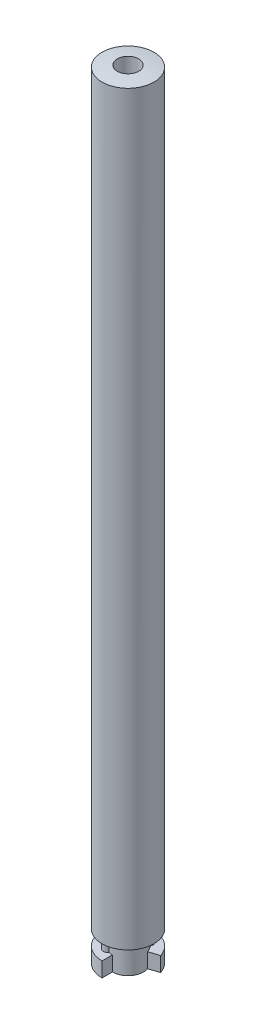
ISO-10303-21;
HEADER;
FILE_DESCRIPTION(('STEP AP214'),'2;1');
FILE_NAME('part.step','',(''),(''),'','','');
FILE_SCHEMA(('AUTOMOTIVE_DESIGN { 1 0 10303 214 1 1 1 1 }'));
ENDSEC;
DATA;
#1=APPLICATION_CONTEXT('core data for automotive mechanical design processes');
#2=APPLICATION_PROTOCOL_DEFINITION('international standard','automotive_design',2000,#1);
#3=PRODUCT_CONTEXT('',#1,'mechanical');
#4=PRODUCT('Part','Part','',(#3));
#5=PRODUCT_RELATED_PRODUCT_CATEGORY('part','',(#4));
#6=PRODUCT_DEFINITION_FORMATION('','',#4);
#7=PRODUCT_DEFINITION_CONTEXT('part definition',#1,'design');
#8=PRODUCT_DEFINITION('design','',#6,#7);
#9=PRODUCT_DEFINITION_SHAPE('','',#8);
#10=(LENGTH_UNIT() NAMED_UNIT(*) SI_UNIT(.MILLI.,.METRE.));
#11=(NAMED_UNIT(*) PLANE_ANGLE_UNIT() SI_UNIT($,.RADIAN.));
#12=(NAMED_UNIT(*) SI_UNIT($,.STERADIAN.) SOLID_ANGLE_UNIT());
#13=UNCERTAINTY_MEASURE_WITH_UNIT(LENGTH_MEASURE(1.E-05),#10,'distance_accuracy_value','');
#14=(GEOMETRIC_REPRESENTATION_CONTEXT(3) GLOBAL_UNCERTAINTY_ASSIGNED_CONTEXT((#13)) GLOBAL_UNIT_ASSIGNED_CONTEXT((#10,
#11,#12)) REPRESENTATION_CONTEXT('',''));
#15=CARTESIAN_POINT('',(0.,0.,0.));
#16=DIRECTION('',(0.,0.,1.));
#17=DIRECTION('',(1.,0.,0.));
#18=AXIS2_PLACEMENT_3D('',#15,#16,#17);
#19=CARTESIAN_POINT('',(0.,105.,0.));
#20=DIRECTION('',(0.,-1.,0.));
#21=DIRECTION('',(0.,0.,-1.));
#22=AXIS2_PLACEMENT_3D('',#19,#20,#21);
#23=CYLINDRICAL_SURFACE('',#22,3.5);
#24=CARTESIAN_POINT('',(0.,4.,0.));
#25=DIRECTION('',(0.,-1.,0.));
#26=DIRECTION('',(0.,0.,-1.));
#27=AXIS2_PLACEMENT_3D('',#24,#25,#26);
#28=CIRCLE('',#27,3.5);
#29=CARTESIAN_POINT('',(0.,4.,-3.5));
#30=VERTEX_POINT('',#29);
#31=EDGE_CURVE('E162',#30,#30,#28,.T.);
#32=ORIENTED_EDGE('',*,*,#31,.F.);
#33=EDGE_LOOP('',(#32));
#34=FACE_BOUND('',#33,.T.);
#35=CARTESIAN_POINT('',(0.,104.7,0.));
#36=DIRECTION('',(0.,1.,0.));
#37=DIRECTION('',(0.,0.,1.));
#38=AXIS2_PLACEMENT_3D('',#35,#36,#37);
#39=CIRCLE('',#38,3.5);
#40=CARTESIAN_POINT('',(0.,104.7,3.5));
#41=VERTEX_POINT('',#40);
#42=EDGE_CURVE('E275',#41,#41,#39,.T.);
#43=ORIENTED_EDGE('',*,*,#42,.F.);
#44=EDGE_LOOP('',(#43));
#45=FACE_BOUND('',#44,.T.);
#46=ADVANCED_FACE('F39',(#34,#45),#23,.T.);
#47=CARTESIAN_POINT('',(0.,2.,0.));
#48=DIRECTION('',(0.,-1.,0.));
#49=DIRECTION('',(0.,0.,-1.));
#50=AXIS2_PLACEMENT_3D('',#47,#48,#49);
#51=CYLINDRICAL_SURFACE('',#50,2.1);
#52=CARTESIAN_POINT('',(0.,2.,0.));
#53=DIRECTION('',(0.,-1.,0.));
#54=DIRECTION('',(0.,0.,-1.));
#55=AXIS2_PLACEMENT_3D('',#52,#53,#54);
#56=CIRCLE('',#55,2.1);
#57=CARTESIAN_POINT('',(-1.49139224809552,2.,1.47842793612694));
#58=VERTEX_POINT('',#57);
#59=CARTESIAN_POINT('',(-1.99721868421978,2.,0.648935688187522));
#60=VERTEX_POINT('',#59);
#61=EDGE_CURVE('E139',#58,#60,#56,.T.);
#62=ORIENTED_EDGE('',*,*,#61,.F.);
#63=DIRECTION('',(0.,-1.,0.));
#64=VECTOR('',#63,1.);
#65=CARTESIAN_POINT('',(-1.49139224809553,3.,1.47842793612694));
#66=LINE('',#65,#64);
#67=CARTESIAN_POINT('',(-1.49139224809552,4.,1.47842793612694));
#68=VERTEX_POINT('',#67);
#69=EDGE_CURVE('E55',#58,#68,#66,.F.);
#70=ORIENTED_EDGE('',*,*,#69,.T.);
#71=CARTESIAN_POINT('',(0.,4.,0.));
#72=DIRECTION('',(0.,-1.,0.));
#73=DIRECTION('',(0.,0.,-1.));
#74=AXIS2_PLACEMENT_3D('',#71,#72,#73);
#75=CIRCLE('',#74,2.1);
#76=CARTESIAN_POINT('',(0.543519994715294,4.,-2.02844423520704));
#77=VERTEX_POINT('',#76);
#78=EDGE_CURVE('E159',#68,#77,#75,.T.);
#79=ORIENTED_EDGE('',*,*,#78,.T.);
#80=DIRECTION('',(0.,-1.,0.));
#81=VECTOR('',#80,1.);
#82=CARTESIAN_POINT('',(0.543519994715294,3.,-2.02844423520704));
#83=LINE('',#82,#81);
#84=CARTESIAN_POINT('',(0.543519994715294,2.,-2.02844423520704));
#85=VERTEX_POINT('',#84);
#86=EDGE_CURVE('E217',#77,#85,#83,.T.);
#87=ORIENTED_EDGE('',*,*,#86,.T.);
#88=CARTESIAN_POINT('',(-1.29886816183054E-13,2.,-2.1));
#89=VERTEX_POINT('',#88);
#90=EDGE_CURVE('E141',#89,#85,#56,.T.);
#91=ORIENTED_EDGE('',*,*,#90,.F.);
#92=DIRECTION('',(0.,-1.,0.));
#93=VECTOR('',#92,1.);
#94=CARTESIAN_POINT('',(-1.29886816183054E-13,2.,-2.1));
#95=LINE('',#94,#93);
#96=CARTESIAN_POINT('',(-1.29886816183054E-13,0.,-2.1));
#97=VERTEX_POINT('',#96);
#98=EDGE_CURVE('E182',#89,#97,#95,.T.);
#99=ORIENTED_EDGE('',*,*,#98,.T.);
#100=CARTESIAN_POINT('',(0.,0.,0.));
#101=DIRECTION('',(0.,-1.,0.));
#102=DIRECTION('',(0.,0.,-1.));
#103=AXIS2_PLACEMENT_3D('',#100,#101,#102);
#104=CIRCLE('',#103,2.1);
#105=CARTESIAN_POINT('',(-1.99721868421978,0.,0.648935688187522));
#106=VERTEX_POINT('',#105);
#107=EDGE_CURVE('E165',#106,#97,#104,.T.);
#108=ORIENTED_EDGE('',*,*,#107,.F.);
#109=DIRECTION('',(0.,-1.,0.));
#110=VECTOR('',#109,1.);
#111=CARTESIAN_POINT('',(-1.99721868421978,2.,0.648935688187522));
#112=LINE('',#111,#110);
#113=EDGE_CURVE('E175',#60,#106,#112,.T.);
#114=ORIENTED_EDGE('',*,*,#113,.F.);
#115=EDGE_LOOP('',(#62,#70,#79,#87,#91,#99,#108,#114));
#116=FACE_BOUND('',#115,.T.);
#117=ADVANCED_FACE('F228',(#116),#51,.T.);
#118=CARTESIAN_POINT('',(1.49139224809554,4.,-1.47842793612693));
#119=VERTEX_POINT('',#118);
#120=CARTESIAN_POINT('',(-0.543519994715282,4.,2.02844423520705));
#121=VERTEX_POINT('',#120);
#122=EDGE_CURVE('E146',#119,#121,#75,.T.);
#123=ORIENTED_EDGE('',*,*,#122,.T.);
#124=DIRECTION('',(0.,-1.,0.));
#125=VECTOR('',#124,1.);
#126=CARTESIAN_POINT('',(-0.543519994715281,3.,2.02844423520705));
#127=LINE('',#126,#125);
#128=CARTESIAN_POINT('',(-0.543519994715281,2.,2.02844423520705));
#129=VERTEX_POINT('',#128);
#130=EDGE_CURVE('E143',#121,#129,#127,.T.);
#131=ORIENTED_EDGE('',*,*,#130,.T.);
#132=CARTESIAN_POINT('',(0.,2.,2.1));
#133=VERTEX_POINT('',#132);
#134=EDGE_CURVE('E130',#133,#129,#56,.T.);
#135=ORIENTED_EDGE('',*,*,#134,.F.);
#136=DIRECTION('',(0.,-1.,0.));
#137=VECTOR('',#136,1.);
#138=CARTESIAN_POINT('',(0.,2.,2.1));
#139=LINE('',#138,#137);
#140=CARTESIAN_POINT('',(0.,0.,2.1));
#141=VERTEX_POINT('',#140);
#142=EDGE_CURVE('E204',#133,#141,#139,.T.);
#143=ORIENTED_EDGE('',*,*,#142,.T.);
#144=CARTESIAN_POINT('',(0.,0.,0.));
#145=DIRECTION('',(0.,-1.,0.));
#146=DIRECTION('',(0.,0.,-1.));
#147=AXIS2_PLACEMENT_3D('',#144,#145,#146);
#148=CIRCLE('',#147,2.1);
#149=CARTESIAN_POINT('',(1.99721868421982,0.,-0.648935688187398));
#150=VERTEX_POINT('',#149);
#151=EDGE_CURVE('E185',#150,#141,#148,.T.);
#152=ORIENTED_EDGE('',*,*,#151,.F.);
#153=DIRECTION('',(0.,-1.,0.));
#154=VECTOR('',#153,1.);
#155=CARTESIAN_POINT('',(1.99721868421982,2.,-0.648935688187398));
#156=LINE('',#155,#154);
#157=CARTESIAN_POINT('',(1.99721868421982,2.,-0.648935688187398));
#158=VERTEX_POINT('',#157);
#159=EDGE_CURVE('E197',#158,#150,#156,.T.);
#160=ORIENTED_EDGE('',*,*,#159,.F.);
#161=CARTESIAN_POINT('',(1.49139224809554,2.,-1.47842793612693));
#162=VERTEX_POINT('',#161);
#163=EDGE_CURVE('E138',#162,#158,#56,.T.);
#164=ORIENTED_EDGE('',*,*,#163,.F.);
#165=DIRECTION('',(0.,-1.,0.));
#166=VECTOR('',#165,1.);
#167=CARTESIAN_POINT('',(1.49139224809554,3.,-1.47842793612693));
#168=LINE('',#167,#166);
#169=EDGE_CURVE('E48',#162,#119,#168,.F.);
#170=ORIENTED_EDGE('',*,*,#169,.T.);
#171=EDGE_LOOP('',(#123,#131,#135,#143,#152,#160,#164,#170));
#172=FACE_BOUND('',#171,.T.);
#173=ADVANCED_FACE('F144',(#172),#51,.T.);
#174=CARTESIAN_POINT('',(0.,2.,0.));
#175=DIRECTION('',(0.,-1.,0.));
#176=DIRECTION('',(0.,0.,-1.));
#177=AXIS2_PLACEMENT_3D('',#174,#175,#176);
#178=PLANE('',#177);
#179=CARTESIAN_POINT('',(1.02599233253928,2.,-1.76814699095529));
#180=DIRECTION('',(0.,1.,0.));
#181=DIRECTION('',(0.,0.,1.));
#182=AXIS2_PLACEMENT_3D('',#179,#180,#181);
#183=CIRCLE('',#182,0.548210007324203);
#184=EDGE_CURVE('E150',#162,#85,#183,.T.);
#185=ORIENTED_EDGE('',*,*,#184,.F.);
#186=ORIENTED_EDGE('',*,*,#163,.T.);
#187=DIRECTION('',(0.951056516295152,0.,-0.309016994374951));
#188=VECTOR('',#187,1.);
#189=CARTESIAN_POINT('',(0.,2.,0.));
#190=LINE('',#189,#188);
#191=CARTESIAN_POINT('',(3.32869780703303,2.,-1.08155948031233));
#192=VERTEX_POINT('',#191);
#193=EDGE_CURVE('E193',#158,#192,#190,.T.);
#194=ORIENTED_EDGE('',*,*,#193,.T.);
#195=CARTESIAN_POINT('',(0.,2.,0.));
#196=DIRECTION('',(0.,-1.,0.));
#197=DIRECTION('',(0.,0.,-1.));
#198=AXIS2_PLACEMENT_3D('',#195,#196,#197);
#199=CIRCLE('',#198,3.5);
#200=CARTESIAN_POINT('',(0.,2.,-3.5));
#201=VERTEX_POINT('',#200);
#202=EDGE_CURVE('E166',#201,#192,#199,.T.);
#203=ORIENTED_EDGE('',*,*,#202,.F.);
#204=DIRECTION('',(0.,0.,-1.));
#205=VECTOR('',#204,1.);
#206=CARTESIAN_POINT('',(0.,2.,0.));
#207=LINE('',#206,#205);
#208=EDGE_CURVE('E171',#89,#201,#207,.T.);
#209=ORIENTED_EDGE('',*,*,#208,.F.);
#210=ORIENTED_EDGE('',*,*,#90,.T.);
#211=EDGE_LOOP('',(#185,#186,#194,#203,#209,#210));
#212=FACE_BOUND('',#211,.T.);
#213=ADVANCED_FACE('F231',(#212),#178,.F.);
#214=CARTESIAN_POINT('',(0.,4.,0.));
#215=DIRECTION('',(0.,-1.,0.));
#216=DIRECTION('',(0.,0.,-1.));
#217=AXIS2_PLACEMENT_3D('',#214,#215,#216);
#218=PLANE('',#217);
#219=ORIENTED_EDGE('',*,*,#78,.F.);
#220=CARTESIAN_POINT('',(-1.02599233253927,4.,1.76814699095529));
#221=DIRECTION('',(0.,1.,0.));
#222=DIRECTION('',(0.,0.,1.));
#223=AXIS2_PLACEMENT_3D('',#220,#221,#222);
#224=CIRCLE('',#223,0.548210007324203);
#225=EDGE_CURVE('E62',#68,#121,#224,.T.);
#226=ORIENTED_EDGE('',*,*,#225,.T.);
#227=ORIENTED_EDGE('',*,*,#122,.F.);
#228=CARTESIAN_POINT('',(1.02599233253928,4.,-1.76814699095529));
#229=DIRECTION('',(0.,1.,0.));
#230=DIRECTION('',(0.,0.,1.));
#231=AXIS2_PLACEMENT_3D('',#228,#229,#230);
#232=CIRCLE('',#231,0.548210007324203);
#233=EDGE_CURVE('E152',#119,#77,#232,.T.);
#234=ORIENTED_EDGE('',*,*,#233,.T.);
#235=EDGE_LOOP('',(#219,#226,#227,#234));
#236=FACE_BOUND('',#235,.T.);
#237=ORIENTED_EDGE('',*,*,#31,.T.);
#238=EDGE_LOOP('',(#237));
#239=FACE_BOUND('',#238,.T.);
#240=ADVANCED_FACE('F224',(#236,#239),#218,.T.);
#241=CARTESIAN_POINT('',(-1.02599233253927,2.,1.76814699095529));
#242=DIRECTION('',(0.,-1.,0.));
#243=DIRECTION('',(0.,0.,-1.));
#244=AXIS2_PLACEMENT_3D('',#241,#242,#243);
#245=CIRCLE('',#244,0.548210007324203);
#246=EDGE_CURVE('E11',#58,#129,#245,.F.);
#247=ORIENTED_EDGE('',*,*,#246,.F.);
#248=ORIENTED_EDGE('',*,*,#61,.T.);
#249=DIRECTION('',(-0.951056516295133,0.,0.30901699437501));
#250=VECTOR('',#249,1.);
#251=CARTESIAN_POINT('',(0.,2.,0.));
#252=LINE('',#251,#250);
#253=CARTESIAN_POINT('',(-3.32869780703297,2.,1.08155948031254));
#254=VERTEX_POINT('',#253);
#255=EDGE_CURVE('E169',#60,#254,#252,.T.);
#256=ORIENTED_EDGE('',*,*,#255,.T.);
#257=CARTESIAN_POINT('',(0.,2.,3.5));
#258=VERTEX_POINT('',#257);
#259=EDGE_CURVE('E158',#258,#254,#199,.T.);
#260=ORIENTED_EDGE('',*,*,#259,.F.);
#261=DIRECTION('',(0.,0.,1.));
#262=VECTOR('',#261,1.);
#263=CARTESIAN_POINT('',(0.,2.,0.));
#264=LINE('',#263,#262);
#265=EDGE_CURVE('E134',#133,#258,#264,.T.);
#266=ORIENTED_EDGE('',*,*,#265,.F.);
#267=ORIENTED_EDGE('',*,*,#134,.T.);
#268=EDGE_LOOP('',(#247,#248,#256,#260,#266,#267));
#269=FACE_BOUND('',#268,.T.);
#270=ADVANCED_FACE('F132',(#269),#178,.F.);
#271=CARTESIAN_POINT('',(0.,0.,0.));
#272=DIRECTION('',(0.,1.,0.));
#273=DIRECTION('',(0.,0.,1.));
#274=AXIS2_PLACEMENT_3D('',#271,#272,#273);
#275=PLANE('',#274);
#276=DIRECTION('',(0.,0.,-1.));
#277=VECTOR('',#276,1.);
#278=CARTESIAN_POINT('',(0.,0.,0.));
#279=LINE('',#278,#277);
#280=CARTESIAN_POINT('',(-2.16478026971757E-13,0.,-3.5));
#281=VERTEX_POINT('',#280);
#282=EDGE_CURVE('E172',#97,#281,#279,.T.);
#283=ORIENTED_EDGE('',*,*,#282,.T.);
#284=CARTESIAN_POINT('',(0.,0.,0.));
#285=DIRECTION('',(0.,1.,0.));
#286=DIRECTION('',(0.,0.,1.));
#287=AXIS2_PLACEMENT_3D('',#284,#285,#286);
#288=CIRCLE('',#287,3.5);
#289=CARTESIAN_POINT('',(3.32869780703303,0.,-1.08155948031233));
#290=VERTEX_POINT('',#289);
#291=EDGE_CURVE('E216',#290,#281,#288,.T.);
#292=ORIENTED_EDGE('',*,*,#291,.F.);
#293=DIRECTION('',(0.951056516295152,0.,-0.309016994374951));
#294=VECTOR('',#293,1.);
#295=CARTESIAN_POINT('',(0.,0.,0.));
#296=LINE('',#295,#294);
#297=EDGE_CURVE('E200',#150,#290,#296,.T.);
#298=ORIENTED_EDGE('',*,*,#297,.F.);
#299=ORIENTED_EDGE('',*,*,#151,.T.);
#300=DIRECTION('',(0.,0.,1.));
#301=VECTOR('',#300,1.);
#302=CARTESIAN_POINT('',(0.,0.,0.));
#303=LINE('',#302,#301);
#304=CARTESIAN_POINT('',(0.,0.,3.5));
#305=VERTEX_POINT('',#304);
#306=EDGE_CURVE('E195',#141,#305,#303,.T.);
#307=ORIENTED_EDGE('',*,*,#306,.T.);
#308=CARTESIAN_POINT('',(-3.32869780703297,0.,1.08155948031254));
#309=VERTEX_POINT('',#308);
#310=EDGE_CURVE('E206',#309,#305,#288,.T.);
#311=ORIENTED_EDGE('',*,*,#310,.F.);
#312=DIRECTION('',(-0.951056516295133,0.,0.30901699437501));
#313=VECTOR('',#312,1.);
#314=CARTESIAN_POINT('',(0.,0.,0.));
#315=LINE('',#314,#313);
#316=EDGE_CURVE('E178',#106,#309,#315,.T.);
#317=ORIENTED_EDGE('',*,*,#316,.F.);
#318=ORIENTED_EDGE('',*,*,#107,.T.);
#319=EDGE_LOOP('',(#283,#292,#298,#299,#307,#311,#317,#318));
#320=FACE_BOUND('',#319,.T.);
#321=ADVANCED_FACE('F239',(#320),#275,.F.);
#322=CARTESIAN_POINT('',(0.,2.,0.));
#323=DIRECTION('',(0.30901699437501,0.,0.951056516295133));
#324=DIRECTION('',(0.951056516295133,0.,-0.30901699437501));
#325=AXIS2_PLACEMENT_3D('',#322,#323,#324);
#326=PLANE('',#325);
#327=ORIENTED_EDGE('',*,*,#316,.T.);
#328=DIRECTION('',(0.,-1.,0.));
#329=VECTOR('',#328,1.);
#330=CARTESIAN_POINT('',(-3.32869780703297,2.,1.08155948031254));
#331=LINE('',#330,#329);
#332=EDGE_CURVE('E188',#254,#309,#331,.T.);
#333=ORIENTED_EDGE('',*,*,#332,.F.);
#334=ORIENTED_EDGE('',*,*,#255,.F.);
#335=ORIENTED_EDGE('',*,*,#113,.T.);
#336=EDGE_LOOP('',(#327,#333,#334,#335));
#337=FACE_BOUND('',#336,.T.);
#338=ADVANCED_FACE('F245',(#337),#326,.F.);
#339=CARTESIAN_POINT('',(0.,2.,0.));
#340=DIRECTION('',(-1.,0.,0.));
#341=DIRECTION('',(0.,0.,1.));
#342=AXIS2_PLACEMENT_3D('',#339,#340,#341);
#343=PLANE('',#342);
#344=ORIENTED_EDGE('',*,*,#282,.F.);
#345=ORIENTED_EDGE('',*,*,#98,.F.);
#346=ORIENTED_EDGE('',*,*,#208,.T.);
#347=DIRECTION('',(0.,-1.,0.));
#348=VECTOR('',#347,1.);
#349=CARTESIAN_POINT('',(-2.16478026971757E-13,2.,-3.5));
#350=LINE('',#349,#348);
#351=EDGE_CURVE('E186',#201,#281,#350,.T.);
#352=ORIENTED_EDGE('',*,*,#351,.T.);
#353=EDGE_LOOP('',(#344,#345,#346,#352));
#354=FACE_BOUND('',#353,.T.);
#355=ADVANCED_FACE('F235',(#354),#343,.T.);
#356=CARTESIAN_POINT('',(0.,2.,0.));
#357=DIRECTION('',(-0.309016994374952,0.,-0.951056516295152));
#358=DIRECTION('',(-0.951056516295152,0.,0.309016994374952));
#359=AXIS2_PLACEMENT_3D('',#356,#357,#358);
#360=PLANE('',#359);
#361=ORIENTED_EDGE('',*,*,#297,.T.);
#362=DIRECTION('',(0.,-1.,0.));
#363=VECTOR('',#362,1.);
#364=CARTESIAN_POINT('',(3.32869780703303,2.,-1.08155948031233));
#365=LINE('',#364,#363);
#366=EDGE_CURVE('E209',#192,#290,#365,.T.);
#367=ORIENTED_EDGE('',*,*,#366,.F.);
#368=ORIENTED_EDGE('',*,*,#193,.F.);
#369=ORIENTED_EDGE('',*,*,#159,.T.);
#370=EDGE_LOOP('',(#361,#367,#368,#369));
#371=FACE_BOUND('',#370,.T.);
#372=ADVANCED_FACE('F255',(#371),#360,.F.);
#373=CARTESIAN_POINT('',(0.,2.,0.));
#374=DIRECTION('',(1.,0.,0.));
#375=DIRECTION('',(0.,0.,-1.));
#376=AXIS2_PLACEMENT_3D('',#373,#374,#375);
#377=PLANE('',#376);
#378=ORIENTED_EDGE('',*,*,#306,.F.);
#379=ORIENTED_EDGE('',*,*,#142,.F.);
#380=ORIENTED_EDGE('',*,*,#265,.T.);
#381=DIRECTION('',(0.,-1.,0.));
#382=VECTOR('',#381,1.);
#383=CARTESIAN_POINT('',(0.,2.,3.5));
#384=LINE('',#383,#382);
#385=EDGE_CURVE('E207',#258,#305,#384,.T.);
#386=ORIENTED_EDGE('',*,*,#385,.T.);
#387=EDGE_LOOP('',(#378,#379,#380,#386));
#388=FACE_BOUND('',#387,.T.);
#389=ADVANCED_FACE('F251',(#388),#377,.T.);
#390=ORIENTED_EDGE('',*,*,#385,.F.);
#391=ORIENTED_EDGE('',*,*,#259,.T.);
#392=ORIENTED_EDGE('',*,*,#332,.T.);
#393=ORIENTED_EDGE('',*,*,#310,.T.);
#394=EDGE_LOOP('',(#390,#391,#392,#393));
#395=FACE_BOUND('',#394,.T.);
#396=ADVANCED_FACE('F41',(#395),#23,.T.);
#397=ORIENTED_EDGE('',*,*,#351,.F.);
#398=ORIENTED_EDGE('',*,*,#202,.T.);
#399=ORIENTED_EDGE('',*,*,#366,.T.);
#400=ORIENTED_EDGE('',*,*,#291,.T.);
#401=EDGE_LOOP('',(#397,#398,#399,#400));
#402=FACE_BOUND('',#401,.T.);
#403=ADVANCED_FACE('F258',(#402),#23,.T.);
#404=CARTESIAN_POINT('',(1.02599233253928,4.,-1.76814699095529));
#405=DIRECTION('',(0.,-1.,0.));
#406=DIRECTION('',(0.,0.,-1.));
#407=AXIS2_PLACEMENT_3D('',#404,#405,#406);
#408=CYLINDRICAL_SURFACE('',#407,0.548210007324203);
#409=ORIENTED_EDGE('',*,*,#169,.F.);
#410=ORIENTED_EDGE('',*,*,#184,.T.);
#411=ORIENTED_EDGE('',*,*,#86,.F.);
#412=ORIENTED_EDGE('',*,*,#233,.F.);
#413=EDGE_LOOP('',(#409,#410,#411,#412));
#414=FACE_BOUND('',#413,.T.);
#415=ADVANCED_FACE('F227',(#414),#408,.T.);
#416=CARTESIAN_POINT('',(-1.02599233253927,4.,1.76814699095529));
#417=DIRECTION('',(0.,-1.,0.));
#418=DIRECTION('',(0.,0.,-1.));
#419=AXIS2_PLACEMENT_3D('',#416,#417,#418);
#420=CYLINDRICAL_SURFACE('',#419,0.548210007324203);
#421=ORIENTED_EDGE('',*,*,#69,.F.);
#422=ORIENTED_EDGE('',*,*,#246,.T.);
#423=ORIENTED_EDGE('',*,*,#130,.F.);
#424=ORIENTED_EDGE('',*,*,#225,.F.);
#425=EDGE_LOOP('',(#421,#422,#423,#424));
#426=FACE_BOUND('',#425,.T.);
#427=ADVANCED_FACE('F149',(#426),#420,.T.);
#428=CARTESIAN_POINT('',(1.20310670450097,104.958820899214,0.));
#429=CARTESIAN_POINT('',(1.97227443081541,104.911940963431,0.));
#430=CARTESIAN_POINT('',(2.737905529315,104.825667330359,0.));
#431=CARTESIAN_POINT('',(3.5,104.7,0.));
#432=B_SPLINE_CURVE_WITH_KNOTS('',3,(#428,#429,#430,#431),.UNSPECIFIED.,.F.,.F.,(4,4),(0.,
0.657831992313741),.UNSPECIFIED.);
#433=CARTESIAN_POINT('',(0.,107.628853610651,0.));
#434=DIRECTION('',(0.,1.,0.));
#435=AXIS1_PLACEMENT('',#433,#434);
#436=SURFACE_OF_REVOLUTION('',#432,#435);
#437=ORIENTED_EDGE('',*,*,#42,.T.);
#438=EDGE_LOOP('',(#437));
#439=FACE_BOUND('',#438,.T.);
#440=CARTESIAN_POINT('',(0.,104.94241132766,0.));
#441=DIRECTION('',(0.,1.,0.));
#442=DIRECTION('',(0.,0.,1.));
#443=AXIS2_PLACEMENT_3D('',#440,#441,#442);
#444=CIRCLE('',#443,1.45);
#445=CARTESIAN_POINT('',(0.,104.94241132766,1.45));
#446=VERTEX_POINT('',#445);
#447=EDGE_CURVE('E43',#446,#446,#444,.F.);
#448=ORIENTED_EDGE('',*,*,#447,.T.);
#449=EDGE_LOOP('',(#448));
#450=FACE_BOUND('',#449,.T.);
#451=ADVANCED_FACE('F296',(#439,#450),#436,.F.);
#452=CARTESIAN_POINT('',(0.,95.,0.));
#453=DIRECTION('',(0.,1.,0.));
#454=DIRECTION('',(0.,0.,1.));
#455=AXIS2_PLACEMENT_3D('',#452,#453,#454);
#456=PLANE('',#455);
#457=CARTESIAN_POINT('',(0.,95.,0.));
#458=DIRECTION('',(0.,1.,0.));
#459=DIRECTION('',(0.,0.,1.));
#460=AXIS2_PLACEMENT_3D('',#457,#458,#459);
#461=CIRCLE('',#460,1.45);
#462=CARTESIAN_POINT('',(0.,95.,1.45));
#463=VERTEX_POINT('',#462);
#464=EDGE_CURVE('E279',#463,#463,#461,.T.);
#465=ORIENTED_EDGE('',*,*,#464,.T.);
#466=EDGE_LOOP('',(#465));
#467=FACE_BOUND('',#466,.T.);
#468=ADVANCED_FACE('F288',(#467),#456,.T.);
#469=CARTESIAN_POINT('',(0.,95.,0.));
#470=DIRECTION('',(0.,1.,0.));
#471=DIRECTION('',(0.,0.,1.));
#472=AXIS2_PLACEMENT_3D('',#469,#470,#471);
#473=CYLINDRICAL_SURFACE('',#472,1.45);
#474=ORIENTED_EDGE('',*,*,#464,.F.);
#475=EDGE_LOOP('',(#474));
#476=FACE_BOUND('',#475,.T.);
#477=ORIENTED_EDGE('',*,*,#447,.F.);
#478=EDGE_LOOP('',(#477));
#479=FACE_BOUND('',#478,.T.);
#480=ADVANCED_FACE('F290',(#476,#479),#473,.F.);
#481=CLOSED_SHELL('',(#46,#117,#173,#213,#240,#270,#321,#338,#355,#372,#389,#396,#403,#415,#427,
#451,#468,#480));
#482=MANIFOLD_SOLID_BREP('B2',#481);
#483=ADVANCED_BREP_SHAPE_REPRESENTATION('',(#18,#482),#14);
#484=SHAPE_DEFINITION_REPRESENTATION(#9,#483);
ENDSEC;
END-ISO-10303-21;
